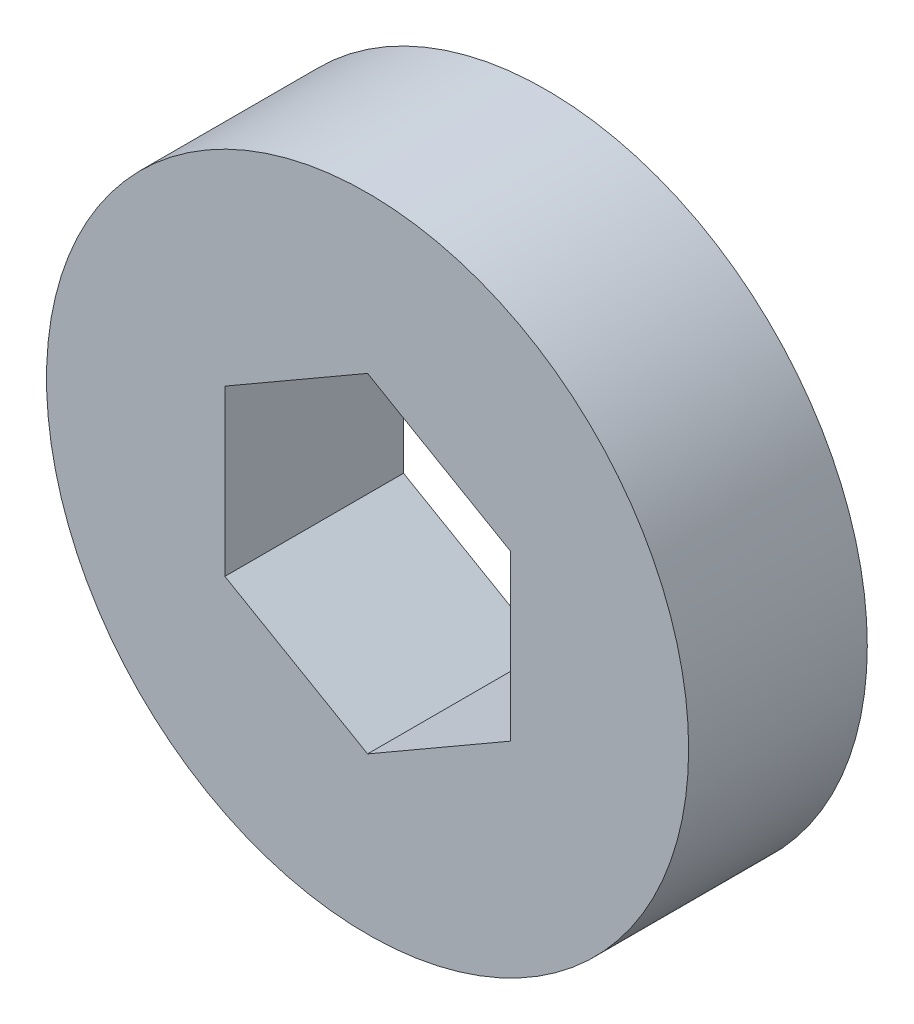
ISO-10303-21;
HEADER;
FILE_DESCRIPTION(('STEP AP214'),'2;1');
FILE_NAME('part.step','',(''),(''),'','','');
FILE_SCHEMA(('AUTOMOTIVE_DESIGN { 1 0 10303 214 1 1 1 1 }'));
ENDSEC;
DATA;
#1=APPLICATION_CONTEXT('core data for automotive mechanical design processes');
#2=APPLICATION_PROTOCOL_DEFINITION('international standard','automotive_design',2000,#1);
#3=PRODUCT_CONTEXT('',#1,'mechanical');
#4=PRODUCT('Part','Part','',(#3));
#5=PRODUCT_RELATED_PRODUCT_CATEGORY('part','',(#4));
#6=PRODUCT_DEFINITION_FORMATION('','',#4);
#7=PRODUCT_DEFINITION_CONTEXT('part definition',#1,'design');
#8=PRODUCT_DEFINITION('design','',#6,#7);
#9=PRODUCT_DEFINITION_SHAPE('','',#8);
#10=(LENGTH_UNIT() NAMED_UNIT(*) SI_UNIT(.MILLI.,.METRE.));
#11=(NAMED_UNIT(*) PLANE_ANGLE_UNIT() SI_UNIT($,.RADIAN.));
#12=(NAMED_UNIT(*) SI_UNIT($,.STERADIAN.) SOLID_ANGLE_UNIT());
#13=UNCERTAINTY_MEASURE_WITH_UNIT(LENGTH_MEASURE(1.E-05),#10,'distance_accuracy_value','');
#14=(GEOMETRIC_REPRESENTATION_CONTEXT(3) GLOBAL_UNCERTAINTY_ASSIGNED_CONTEXT((#13)) GLOBAL_UNIT_ASSIGNED_CONTEXT((#10,
#11,#12)) REPRESENTATION_CONTEXT('',''));
#15=CARTESIAN_POINT('',(0.,0.,0.));
#16=DIRECTION('',(0.,0.,1.));
#17=DIRECTION('',(1.,0.,0.));
#18=AXIS2_PLACEMENT_3D('',#15,#16,#17);
#19=CARTESIAN_POINT('',(0.,0.,7.9502));
#20=DIRECTION('',(0.,0.,1.));
#21=DIRECTION('',(1.,0.,0.));
#22=AXIS2_PLACEMENT_3D('',#19,#20,#21);
#23=PLANE('',#22);
#24=CARTESIAN_POINT('',(0.,0.,7.9502));
#25=DIRECTION('',(0.,0.,1.));
#26=DIRECTION('',(1.,0.,0.));
#27=AXIS2_PLACEMENT_3D('',#24,#25,#26);
#28=CIRCLE('',#27,14.2875);
#29=CARTESIAN_POINT('',(14.2875,0.,7.9502));
#30=VERTEX_POINT('',#29);
#31=EDGE_CURVE('E11',#30,#30,#28,.T.);
#32=ORIENTED_EDGE('',*,*,#31,.T.);
#33=EDGE_LOOP('',(#32));
#34=FACE_BOUND('',#33,.T.);
#35=DIRECTION('',(0.,-1.,0.));
#36=VECTOR('',#35,1.);
#37=CARTESIAN_POINT('',(-6.35,3.66617420935412,7.9502));
#38=LINE('',#37,#36);
#39=CARTESIAN_POINT('',(-6.35,3.66617420935412,7.9502));
#40=VERTEX_POINT('',#39);
#41=CARTESIAN_POINT('',(-6.35,-3.66617420935412,7.9502));
#42=VERTEX_POINT('',#41);
#43=EDGE_CURVE('E100',#40,#42,#38,.T.);
#44=ORIENTED_EDGE('',*,*,#43,.F.);
#45=DIRECTION('',(-0.866025403784439,-0.5,0.));
#46=VECTOR('',#45,1.);
#47=CARTESIAN_POINT('',(0.,7.33234841870825,7.9502));
#48=LINE('',#47,#46);
#49=CARTESIAN_POINT('',(0.,7.33234841870825,7.9502));
#50=VERTEX_POINT('',#49);
#51=EDGE_CURVE('E92',#50,#40,#48,.T.);
#52=ORIENTED_EDGE('',*,*,#51,.F.);
#53=DIRECTION('',(-0.866025403784438,0.5,0.));
#54=VECTOR('',#53,1.);
#55=CARTESIAN_POINT('',(6.35,3.66617420935412,7.9502));
#56=LINE('',#55,#54);
#57=CARTESIAN_POINT('',(6.35,3.66617420935412,7.9502));
#58=VERTEX_POINT('',#57);
#59=EDGE_CURVE('E120',#58,#50,#56,.T.);
#60=ORIENTED_EDGE('',*,*,#59,.F.);
#61=DIRECTION('',(0.,1.,0.));
#62=VECTOR('',#61,1.);
#63=CARTESIAN_POINT('',(6.35,-3.66617420935412,7.9502));
#64=LINE('',#63,#62);
#65=CARTESIAN_POINT('',(6.35,-3.66617420935412,7.9502));
#66=VERTEX_POINT('',#65);
#67=EDGE_CURVE('E118',#66,#58,#64,.T.);
#68=ORIENTED_EDGE('',*,*,#67,.F.);
#69=DIRECTION('',(0.866025403784439,0.5,0.));
#70=VECTOR('',#69,1.);
#71=CARTESIAN_POINT('',(0.,-7.33234841870825,7.9502));
#72=LINE('',#71,#70);
#73=CARTESIAN_POINT('',(0.,-7.33234841870825,7.9502));
#74=VERTEX_POINT('',#73);
#75=EDGE_CURVE('E114',#74,#66,#72,.T.);
#76=ORIENTED_EDGE('',*,*,#75,.F.);
#77=DIRECTION('',(0.866025403784438,-0.5,0.));
#78=VECTOR('',#77,1.);
#79=CARTESIAN_POINT('',(-6.35,-3.66617420935412,7.9502));
#80=LINE('',#79,#78);
#81=EDGE_CURVE('E112',#42,#74,#80,.T.);
#82=ORIENTED_EDGE('',*,*,#81,.F.);
#83=EDGE_LOOP('',(#44,#52,#60,#68,#76,#82));
#84=FACE_BOUND('',#83,.T.);
#85=ADVANCED_FACE('F39',(#34,#84),#23,.T.);
#86=CARTESIAN_POINT('',(0.,0.,0.));
#87=DIRECTION('',(0.,0.,1.));
#88=DIRECTION('',(1.,0.,0.));
#89=AXIS2_PLACEMENT_3D('',#86,#87,#88);
#90=PLANE('',#89);
#91=CARTESIAN_POINT('',(0.,0.,0.));
#92=DIRECTION('',(0.,0.,1.));
#93=DIRECTION('',(1.,0.,0.));
#94=AXIS2_PLACEMENT_3D('',#91,#92,#93);
#95=CIRCLE('',#94,14.2875);
#96=CARTESIAN_POINT('',(14.2875,0.,0.));
#97=VERTEX_POINT('',#96);
#98=EDGE_CURVE('E43',#97,#97,#95,.T.);
#99=ORIENTED_EDGE('',*,*,#98,.F.);
#100=EDGE_LOOP('',(#99));
#101=FACE_BOUND('',#100,.T.);
#102=DIRECTION('',(-0.866025403784439,-0.5,0.));
#103=VECTOR('',#102,1.);
#104=CARTESIAN_POINT('',(0.,7.33234841870825,0.));
#105=LINE('',#104,#103);
#106=CARTESIAN_POINT('',(0.,7.33234841870825,0.));
#107=VERTEX_POINT('',#106);
#108=CARTESIAN_POINT('',(-6.35,3.66617420935412,0.));
#109=VERTEX_POINT('',#108);
#110=EDGE_CURVE('E62',#107,#109,#105,.T.);
#111=ORIENTED_EDGE('',*,*,#110,.T.);
#112=DIRECTION('',(0.,-1.,0.));
#113=VECTOR('',#112,1.);
#114=CARTESIAN_POINT('',(-6.35,3.66617420935412,0.));
#115=LINE('',#114,#113);
#116=CARTESIAN_POINT('',(-6.35,-3.66617420935412,0.));
#117=VERTEX_POINT('',#116);
#118=EDGE_CURVE('E107',#109,#117,#115,.T.);
#119=ORIENTED_EDGE('',*,*,#118,.T.);
#120=DIRECTION('',(0.866025403784438,-0.5,0.));
#121=VECTOR('',#120,1.);
#122=CARTESIAN_POINT('',(-6.35,-3.66617420935412,0.));
#123=LINE('',#122,#121);
#124=CARTESIAN_POINT('',(0.,-7.33234841870825,0.));
#125=VERTEX_POINT('',#124);
#126=EDGE_CURVE('E124',#117,#125,#123,.T.);
#127=ORIENTED_EDGE('',*,*,#126,.T.);
#128=DIRECTION('',(0.866025403784439,0.5,0.));
#129=VECTOR('',#128,1.);
#130=CARTESIAN_POINT('',(0.,-7.33234841870825,0.));
#131=LINE('',#130,#129);
#132=CARTESIAN_POINT('',(6.35,-3.66617420935412,0.));
#133=VERTEX_POINT('',#132);
#134=EDGE_CURVE('E127',#125,#133,#131,.T.);
#135=ORIENTED_EDGE('',*,*,#134,.T.);
#136=DIRECTION('',(0.,1.,0.));
#137=VECTOR('',#136,1.);
#138=CARTESIAN_POINT('',(6.35,-3.66617420935412,0.));
#139=LINE('',#138,#137);
#140=CARTESIAN_POINT('',(6.35,3.66617420935412,0.));
#141=VERTEX_POINT('',#140);
#142=EDGE_CURVE('E130',#133,#141,#139,.T.);
#143=ORIENTED_EDGE('',*,*,#142,.T.);
#144=DIRECTION('',(-0.866025403784438,0.5,0.));
#145=VECTOR('',#144,1.);
#146=CARTESIAN_POINT('',(6.35,3.66617420935412,0.));
#147=LINE('',#146,#145);
#148=EDGE_CURVE('E101',#141,#107,#147,.T.);
#149=ORIENTED_EDGE('',*,*,#148,.T.);
#150=EDGE_LOOP('',(#111,#119,#127,#135,#143,#149));
#151=FACE_BOUND('',#150,.T.);
#152=ADVANCED_FACE('F147',(#101,#151),#90,.F.);
#153=CARTESIAN_POINT('',(0.,0.,7.9502));
#154=DIRECTION('',(0.,0.,-1.));
#155=DIRECTION('',(-1.,0.,0.));
#156=AXIS2_PLACEMENT_3D('',#153,#154,#155);
#157=CYLINDRICAL_SURFACE('',#156,14.2875);
#158=ORIENTED_EDGE('',*,*,#31,.F.);
#159=EDGE_LOOP('',(#158));
#160=FACE_BOUND('',#159,.T.);
#161=ORIENTED_EDGE('',*,*,#98,.T.);
#162=EDGE_LOOP('',(#161));
#163=FACE_BOUND('',#162,.T.);
#164=ADVANCED_FACE('F41',(#160,#163),#157,.T.);
#165=CARTESIAN_POINT('',(0.,7.33234841870825,7.9502));
#166=DIRECTION('',(0.5,-0.866025403784439,0.));
#167=DIRECTION('',(0.866025403784439,0.5,0.));
#168=AXIS2_PLACEMENT_3D('',#165,#166,#167);
#169=PLANE('',#168);
#170=ORIENTED_EDGE('',*,*,#110,.F.);
#171=DIRECTION('',(0.,0.,-1.));
#172=VECTOR('',#171,1.);
#173=CARTESIAN_POINT('',(0.,7.33234841870825,7.9502));
#174=LINE('',#173,#172);
#175=EDGE_CURVE('E96',#50,#107,#174,.T.);
#176=ORIENTED_EDGE('',*,*,#175,.F.);
#177=ORIENTED_EDGE('',*,*,#51,.T.);
#178=DIRECTION('',(0.,0.,-1.));
#179=VECTOR('',#178,1.);
#180=CARTESIAN_POINT('',(-6.35,3.66617420935412,7.9502));
#181=LINE('',#180,#179);
#182=EDGE_CURVE('E95',#40,#109,#181,.T.);
#183=ORIENTED_EDGE('',*,*,#182,.T.);
#184=EDGE_LOOP('',(#170,#176,#177,#183));
#185=FACE_BOUND('',#184,.T.);
#186=ADVANCED_FACE('F94',(#185),#169,.T.);
#187=CARTESIAN_POINT('',(-6.35,3.66617420935412,7.9502));
#188=DIRECTION('',(1.,0.,0.));
#189=DIRECTION('',(0.,1.,0.));
#190=AXIS2_PLACEMENT_3D('',#187,#188,#189);
#191=PLANE('',#190);
#192=ORIENTED_EDGE('',*,*,#118,.F.);
#193=ORIENTED_EDGE('',*,*,#182,.F.);
#194=ORIENTED_EDGE('',*,*,#43,.T.);
#195=DIRECTION('',(0.,0.,-1.));
#196=VECTOR('',#195,1.);
#197=CARTESIAN_POINT('',(-6.35,-3.66617420935412,7.9502));
#198=LINE('',#197,#196);
#199=EDGE_CURVE('E108',#42,#117,#198,.T.);
#200=ORIENTED_EDGE('',*,*,#199,.T.);
#201=EDGE_LOOP('',(#192,#193,#194,#200));
#202=FACE_BOUND('',#201,.T.);
#203=ADVANCED_FACE('F104',(#202),#191,.T.);
#204=CARTESIAN_POINT('',(-6.35,-3.66617420935412,7.9502));
#205=DIRECTION('',(0.5,0.866025403784439,0.));
#206=DIRECTION('',(-0.866025403784439,0.5,0.));
#207=AXIS2_PLACEMENT_3D('',#204,#205,#206);
#208=PLANE('',#207);
#209=ORIENTED_EDGE('',*,*,#126,.F.);
#210=ORIENTED_EDGE('',*,*,#199,.F.);
#211=ORIENTED_EDGE('',*,*,#81,.T.);
#212=DIRECTION('',(0.,0.,-1.));
#213=VECTOR('',#212,1.);
#214=CARTESIAN_POINT('',(0.,-7.33234841870825,7.9502));
#215=LINE('',#214,#213);
#216=EDGE_CURVE('E139',#74,#125,#215,.T.);
#217=ORIENTED_EDGE('',*,*,#216,.T.);
#218=EDGE_LOOP('',(#209,#210,#211,#217));
#219=FACE_BOUND('',#218,.T.);
#220=ADVANCED_FACE('F143',(#219),#208,.T.);
#221=CARTESIAN_POINT('',(0.,-7.33234841870825,7.9502));
#222=DIRECTION('',(-0.5,0.866025403784439,0.));
#223=DIRECTION('',(-0.866025403784439,-0.5,0.));
#224=AXIS2_PLACEMENT_3D('',#221,#222,#223);
#225=PLANE('',#224);
#226=ORIENTED_EDGE('',*,*,#134,.F.);
#227=ORIENTED_EDGE('',*,*,#216,.F.);
#228=ORIENTED_EDGE('',*,*,#75,.T.);
#229=DIRECTION('',(0.,0.,-1.));
#230=VECTOR('',#229,1.);
#231=CARTESIAN_POINT('',(6.35,-3.66617420935412,7.9502));
#232=LINE('',#231,#230);
#233=EDGE_CURVE('E137',#66,#133,#232,.T.);
#234=ORIENTED_EDGE('',*,*,#233,.T.);
#235=EDGE_LOOP('',(#226,#227,#228,#234));
#236=FACE_BOUND('',#235,.T.);
#237=ADVANCED_FACE('F155',(#236),#225,.T.);
#238=CARTESIAN_POINT('',(6.35,-3.66617420935412,7.9502));
#239=DIRECTION('',(-1.,0.,0.));
#240=DIRECTION('',(0.,-1.,0.));
#241=AXIS2_PLACEMENT_3D('',#238,#239,#240);
#242=PLANE('',#241);
#243=ORIENTED_EDGE('',*,*,#142,.F.);
#244=ORIENTED_EDGE('',*,*,#233,.F.);
#245=ORIENTED_EDGE('',*,*,#67,.T.);
#246=DIRECTION('',(0.,0.,-1.));
#247=VECTOR('',#246,1.);
#248=CARTESIAN_POINT('',(6.35,3.66617420935412,7.9502));
#249=LINE('',#248,#247);
#250=EDGE_CURVE('E54',#58,#141,#249,.T.);
#251=ORIENTED_EDGE('',*,*,#250,.T.);
#252=EDGE_LOOP('',(#243,#244,#245,#251));
#253=FACE_BOUND('',#252,.T.);
#254=ADVANCED_FACE('F153',(#253),#242,.T.);
#255=CARTESIAN_POINT('',(6.35,3.66617420935412,7.9502));
#256=DIRECTION('',(-0.5,-0.866025403784439,0.));
#257=DIRECTION('',(0.866025403784439,-0.5,0.));
#258=AXIS2_PLACEMENT_3D('',#255,#256,#257);
#259=PLANE('',#258);
#260=ORIENTED_EDGE('',*,*,#148,.F.);
#261=ORIENTED_EDGE('',*,*,#250,.F.);
#262=ORIENTED_EDGE('',*,*,#59,.T.);
#263=ORIENTED_EDGE('',*,*,#175,.T.);
#264=EDGE_LOOP('',(#260,#261,#262,#263));
#265=FACE_BOUND('',#264,.T.);
#266=ADVANCED_FACE('F149',(#265),#259,.T.);
#267=CLOSED_SHELL('',(#85,#152,#164,#186,#203,#220,#237,#254,#266));
#268=MANIFOLD_SOLID_BREP('B2',#267);
#269=ADVANCED_BREP_SHAPE_REPRESENTATION('',(#18,#268),#14);
#270=SHAPE_DEFINITION_REPRESENTATION(#9,#269);
ENDSEC;
END-ISO-10303-21;
